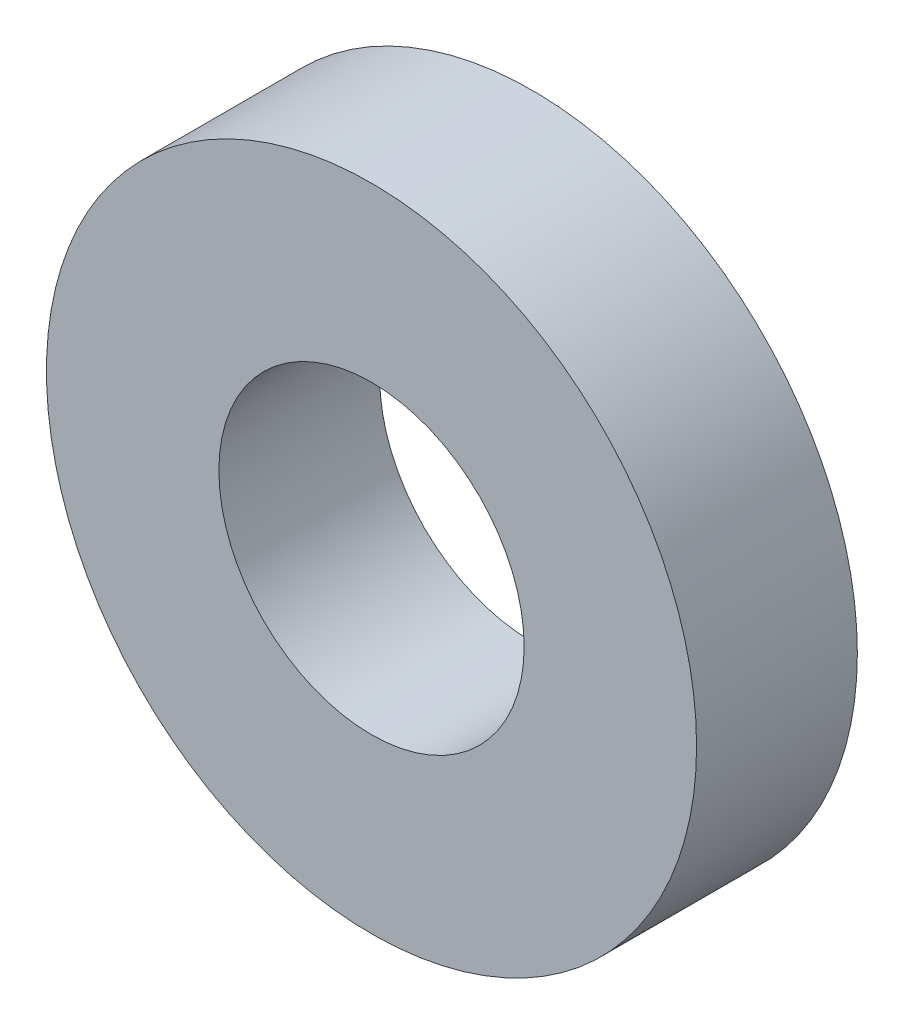
ISO-10303-21;
HEADER;
FILE_DESCRIPTION(('STEP AP214'),'2;1');
FILE_NAME('part.step','',(''),(''),'','','');
FILE_SCHEMA(('AUTOMOTIVE_DESIGN { 1 0 10303 214 1 1 1 1 }'));
ENDSEC;
DATA;
#1=APPLICATION_CONTEXT('core data for automotive mechanical design processes');
#2=APPLICATION_PROTOCOL_DEFINITION('international standard','automotive_design',2000,#1);
#3=PRODUCT_CONTEXT('',#1,'mechanical');
#4=PRODUCT('Part','Part','',(#3));
#5=PRODUCT_RELATED_PRODUCT_CATEGORY('part','',(#4));
#6=PRODUCT_DEFINITION_FORMATION('','',#4);
#7=PRODUCT_DEFINITION_CONTEXT('part definition',#1,'design');
#8=PRODUCT_DEFINITION('design','',#6,#7);
#9=PRODUCT_DEFINITION_SHAPE('','',#8);
#10=(LENGTH_UNIT() NAMED_UNIT(*) SI_UNIT(.MILLI.,.METRE.));
#11=(NAMED_UNIT(*) PLANE_ANGLE_UNIT() SI_UNIT($,.RADIAN.));
#12=(NAMED_UNIT(*) SI_UNIT($,.STERADIAN.) SOLID_ANGLE_UNIT());
#13=UNCERTAINTY_MEASURE_WITH_UNIT(LENGTH_MEASURE(1.E-05),#10,'distance_accuracy_value','');
#14=(GEOMETRIC_REPRESENTATION_CONTEXT(3) GLOBAL_UNCERTAINTY_ASSIGNED_CONTEXT((#13)) GLOBAL_UNIT_ASSIGNED_CONTEXT((#10,
#11,#12)) REPRESENTATION_CONTEXT('',''));
#15=CARTESIAN_POINT('',(0.,0.,0.));
#16=DIRECTION('',(0.,0.,1.));
#17=DIRECTION('',(1.,0.,0.));
#18=AXIS2_PLACEMENT_3D('',#15,#16,#17);
#19=CARTESIAN_POINT('',(5.371,-7.193,11.731));
#20=DIRECTION('',(0.,0.,1.));
#21=DIRECTION('',(1.,0.,0.));
#22=AXIS2_PLACEMENT_3D('',#19,#20,#21);
#23=PLANE('',#22);
#24=CARTESIAN_POINT('',(5.371,-7.193,11.731));
#25=DIRECTION('',(0.,0.,1.));
#26=DIRECTION('',(1.,0.,0.));
#27=AXIS2_PLACEMENT_3D('',#24,#25,#26);
#28=CIRCLE('',#27,23.719);
#29=CARTESIAN_POINT('',(29.09,-7.193,11.731));
#30=VERTEX_POINT('',#29);
#31=EDGE_CURVE('E10',#30,#30,#28,.T.);
#32=ORIENTED_EDGE('',*,*,#31,.T.);
#33=EDGE_LOOP('',(#32));
#34=FACE_BOUND('',#33,.T.);
#35=CARTESIAN_POINT('',(5.371,-7.193,11.731));
#36=DIRECTION('',(0.,0.,1.));
#37=DIRECTION('',(1.,0.,0.));
#38=AXIS2_PLACEMENT_3D('',#35,#36,#37);
#39=CIRCLE('',#38,11.137);
#40=CARTESIAN_POINT('',(16.508,-7.193,11.731));
#41=VERTEX_POINT('',#40);
#42=EDGE_CURVE('E49',#41,#41,#39,.T.);
#43=ORIENTED_EDGE('',*,*,#42,.F.);
#44=EDGE_LOOP('',(#43));
#45=FACE_BOUND('',#44,.T.);
#46=ADVANCED_FACE('F39',(#34,#45),#23,.T.);
#47=CARTESIAN_POINT('',(5.371,-7.193,0.));
#48=DIRECTION('',(0.,0.,1.));
#49=DIRECTION('',(1.,0.,0.));
#50=AXIS2_PLACEMENT_3D('',#47,#48,#49);
#51=PLANE('',#50);
#52=CARTESIAN_POINT('',(5.371,-7.193,0.));
#53=DIRECTION('',(0.,0.,1.));
#54=DIRECTION('',(1.,0.,0.));
#55=AXIS2_PLACEMENT_3D('',#52,#53,#54);
#56=CIRCLE('',#55,23.719);
#57=CARTESIAN_POINT('',(29.09,-7.193,0.));
#58=VERTEX_POINT('',#57);
#59=EDGE_CURVE('E43',#58,#58,#56,.T.);
#60=ORIENTED_EDGE('',*,*,#59,.F.);
#61=EDGE_LOOP('',(#60));
#62=FACE_BOUND('',#61,.T.);
#63=CARTESIAN_POINT('',(5.371,-7.193,0.));
#64=DIRECTION('',(0.,0.,1.));
#65=DIRECTION('',(1.,0.,0.));
#66=AXIS2_PLACEMENT_3D('',#63,#64,#65);
#67=CIRCLE('',#66,11.137);
#68=CARTESIAN_POINT('',(16.508,-7.193,0.));
#69=VERTEX_POINT('',#68);
#70=EDGE_CURVE('E55',#69,#69,#67,.T.);
#71=ORIENTED_EDGE('',*,*,#70,.T.);
#72=EDGE_LOOP('',(#71));
#73=FACE_BOUND('',#72,.T.);
#74=ADVANCED_FACE('F64',(#62,#73),#51,.F.);
#75=CARTESIAN_POINT('',(5.371,-7.193,11.731));
#76=DIRECTION('',(0.,0.,-1.));
#77=DIRECTION('',(-1.,0.,0.));
#78=AXIS2_PLACEMENT_3D('',#75,#76,#77);
#79=CYLINDRICAL_SURFACE('',#78,23.719);
#80=ORIENTED_EDGE('',*,*,#31,.F.);
#81=EDGE_LOOP('',(#80));
#82=FACE_BOUND('',#81,.T.);
#83=ORIENTED_EDGE('',*,*,#59,.T.);
#84=EDGE_LOOP('',(#83));
#85=FACE_BOUND('',#84,.T.);
#86=ADVANCED_FACE('F41',(#82,#85),#79,.T.);
#87=CARTESIAN_POINT('',(5.371,-7.193,11.731));
#88=DIRECTION('',(0.,0.,-1.));
#89=DIRECTION('',(-1.,0.,0.));
#90=AXIS2_PLACEMENT_3D('',#87,#88,#89);
#91=CYLINDRICAL_SURFACE('',#90,11.137);
#92=ORIENTED_EDGE('',*,*,#42,.T.);
#93=EDGE_LOOP('',(#92));
#94=FACE_BOUND('',#93,.T.);
#95=ORIENTED_EDGE('',*,*,#70,.F.);
#96=EDGE_LOOP('',(#95));
#97=FACE_BOUND('',#96,.T.);
#98=ADVANCED_FACE('F59',(#94,#97),#91,.F.);
#99=CLOSED_SHELL('',(#46,#74,#86,#98));
#100=MANIFOLD_SOLID_BREP('B2',#99);
#101=ADVANCED_BREP_SHAPE_REPRESENTATION('',(#18,#100),#14);
#102=SHAPE_DEFINITION_REPRESENTATION(#9,#101);
ENDSEC;
END-ISO-10303-21;
